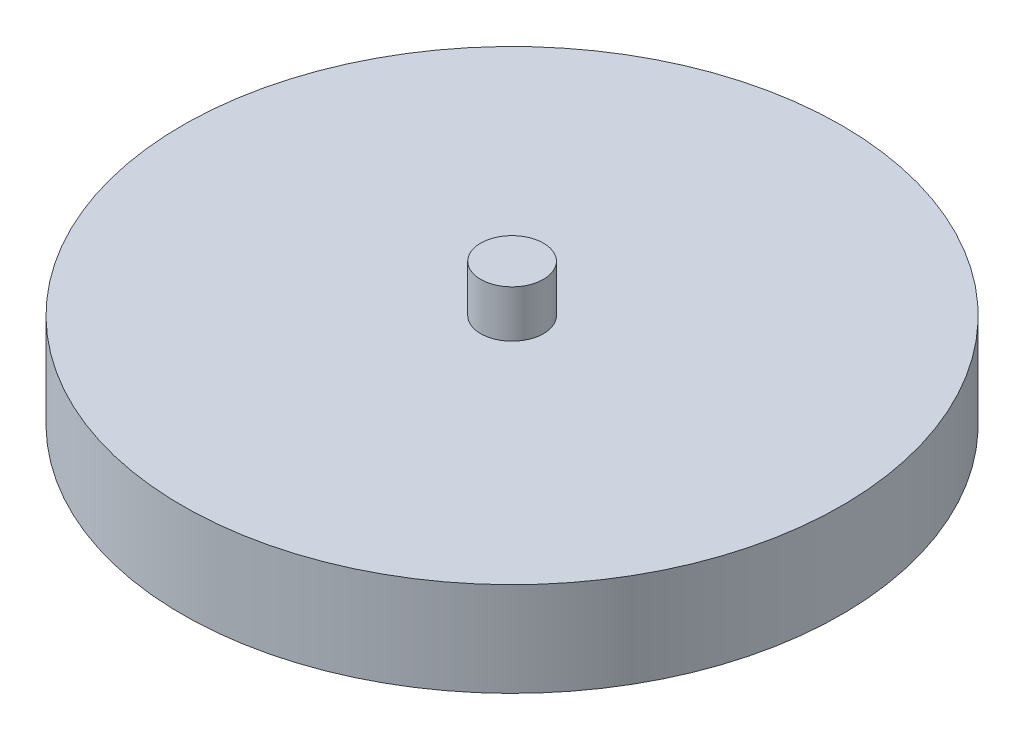
ISO-10303-21;
HEADER;
FILE_DESCRIPTION(('STEP AP214'),'2;1');
FILE_NAME('part.step','',(''),(''),'','','');
FILE_SCHEMA(('AUTOMOTIVE_DESIGN { 1 0 10303 214 1 1 1 1 }'));
ENDSEC;
DATA;
#1=APPLICATION_CONTEXT('core data for automotive mechanical design processes');
#2=APPLICATION_PROTOCOL_DEFINITION('international standard','automotive_design',2000,#1);
#3=PRODUCT_CONTEXT('',#1,'mechanical');
#4=PRODUCT('Part','Part','',(#3));
#5=PRODUCT_RELATED_PRODUCT_CATEGORY('part','',(#4));
#6=PRODUCT_DEFINITION_FORMATION('','',#4);
#7=PRODUCT_DEFINITION_CONTEXT('part definition',#1,'design');
#8=PRODUCT_DEFINITION('design','',#6,#7);
#9=PRODUCT_DEFINITION_SHAPE('','',#8);
#10=(LENGTH_UNIT() NAMED_UNIT(*) SI_UNIT(.MILLI.,.METRE.));
#11=(NAMED_UNIT(*) PLANE_ANGLE_UNIT() SI_UNIT($,.RADIAN.));
#12=(NAMED_UNIT(*) SI_UNIT($,.STERADIAN.) SOLID_ANGLE_UNIT());
#13=UNCERTAINTY_MEASURE_WITH_UNIT(LENGTH_MEASURE(1.E-05),#10,'distance_accuracy_value','');
#14=(GEOMETRIC_REPRESENTATION_CONTEXT(3) GLOBAL_UNCERTAINTY_ASSIGNED_CONTEXT((#13)) GLOBAL_UNIT_ASSIGNED_CONTEXT((#10,
#11,#12)) REPRESENTATION_CONTEXT('',''));
#15=CARTESIAN_POINT('',(0.,0.,0.));
#16=DIRECTION('',(0.,0.,1.));
#17=DIRECTION('',(1.,0.,0.));
#18=AXIS2_PLACEMENT_3D('',#15,#16,#17);
#19=CARTESIAN_POINT('',(-10.,15.,0.));
#20=DIRECTION('',(0.,-1.,0.));
#21=DIRECTION('',(0.,0.,-1.));
#22=AXIS2_PLACEMENT_3D('',#19,#20,#21);
#23=PLANE('',#22);
#24=CARTESIAN_POINT('',(0.,15.,0.));
#25=DIRECTION('',(0.,-1.,0.));
#26=DIRECTION('',(0.,0.,-1.));
#27=AXIS2_PLACEMENT_3D('',#24,#25,#26);
#28=CIRCLE('',#27,10.);
#29=CARTESIAN_POINT('',(0.,15.,-10.));
#30=VERTEX_POINT('',#29);
#31=EDGE_CURVE('E10',#30,#30,#28,.T.);
#32=ORIENTED_EDGE('',*,*,#31,.F.);
#33=EDGE_LOOP('',(#32));
#34=FACE_BOUND('',#33,.T.);
#35=ADVANCED_FACE('F46',(#34),#23,.F.);
#36=CARTESIAN_POINT('',(0.,0.,0.));
#37=DIRECTION('',(0.,-1.,0.));
#38=DIRECTION('',(0.,0.,-1.));
#39=AXIS2_PLACEMENT_3D('',#36,#37,#38);
#40=CYLINDRICAL_SURFACE('',#39,10.);
#41=CARTESIAN_POINT('',(0.,0.,0.));
#42=DIRECTION('',(0.,-1.,0.));
#43=DIRECTION('',(0.,0.,-1.));
#44=AXIS2_PLACEMENT_3D('',#41,#42,#43);
#45=CIRCLE('',#44,10.);
#46=CARTESIAN_POINT('',(0.,0.,-10.));
#47=VERTEX_POINT('',#46);
#48=EDGE_CURVE('E53',#47,#47,#45,.T.);
#49=ORIENTED_EDGE('',*,*,#48,.F.);
#50=EDGE_LOOP('',(#49));
#51=FACE_BOUND('',#50,.T.);
#52=ORIENTED_EDGE('',*,*,#31,.T.);
#53=EDGE_LOOP('',(#52));
#54=FACE_BOUND('',#53,.T.);
#55=ADVANCED_FACE('F80',(#51,#54),#40,.T.);
#56=CARTESIAN_POINT('',(-10.,0.,0.));
#57=DIRECTION('',(0.,-1.,0.));
#58=DIRECTION('',(0.,0.,-1.));
#59=AXIS2_PLACEMENT_3D('',#56,#57,#58);
#60=PLANE('',#59);
#61=CARTESIAN_POINT('',(0.,0.,0.));
#62=DIRECTION('',(0.,-1.,0.));
#63=DIRECTION('',(0.,0.,-1.));
#64=AXIS2_PLACEMENT_3D('',#61,#62,#63);
#65=CIRCLE('',#64,105.);
#66=CARTESIAN_POINT('',(0.,0.,-105.));
#67=VERTEX_POINT('',#66);
#68=EDGE_CURVE('E58',#67,#67,#65,.T.);
#69=ORIENTED_EDGE('',*,*,#68,.F.);
#70=EDGE_LOOP('',(#69));
#71=FACE_BOUND('',#70,.T.);
#72=ORIENTED_EDGE('',*,*,#48,.T.);
#73=EDGE_LOOP('',(#72));
#74=FACE_BOUND('',#73,.T.);
#75=ADVANCED_FACE('F75',(#71,#74),#60,.F.);
#76=CARTESIAN_POINT('',(0.,0.,0.));
#77=DIRECTION('',(0.,-1.,0.));
#78=DIRECTION('',(0.,0.,-1.));
#79=AXIS2_PLACEMENT_3D('',#76,#77,#78);
#80=CYLINDRICAL_SURFACE('',#79,105.);
#81=CARTESIAN_POINT('',(0.,-30.,0.));
#82=DIRECTION('',(0.,-1.,0.));
#83=DIRECTION('',(0.,0.,-1.));
#84=AXIS2_PLACEMENT_3D('',#81,#82,#83);
#85=CIRCLE('',#84,105.);
#86=CARTESIAN_POINT('',(0.,-30.,-105.));
#87=VERTEX_POINT('',#86);
#88=EDGE_CURVE('E63',#87,#87,#85,.T.);
#89=ORIENTED_EDGE('',*,*,#88,.F.);
#90=EDGE_LOOP('',(#89));
#91=FACE_BOUND('',#90,.T.);
#92=ORIENTED_EDGE('',*,*,#68,.T.);
#93=EDGE_LOOP('',(#92));
#94=FACE_BOUND('',#93,.T.);
#95=ADVANCED_FACE('F72',(#91,#94),#80,.T.);
#96=CARTESIAN_POINT('',(-105.,-30.,0.));
#97=DIRECTION('',(0.,1.,0.));
#98=DIRECTION('',(0.,0.,1.));
#99=AXIS2_PLACEMENT_3D('',#96,#97,#98);
#100=PLANE('',#99);
#101=ORIENTED_EDGE('',*,*,#88,.T.);
#102=EDGE_LOOP('',(#101));
#103=FACE_BOUND('',#102,.T.);
#104=ADVANCED_FACE('F70',(#103),#100,.F.);
#105=CLOSED_SHELL('',(#35,#55,#75,#95,#104));
#106=MANIFOLD_SOLID_BREP('B2',#105);
#107=ADVANCED_BREP_SHAPE_REPRESENTATION('',(#18,#106),#14);
#108=SHAPE_DEFINITION_REPRESENTATION(#9,#107);
ENDSEC;
END-ISO-10303-21;
